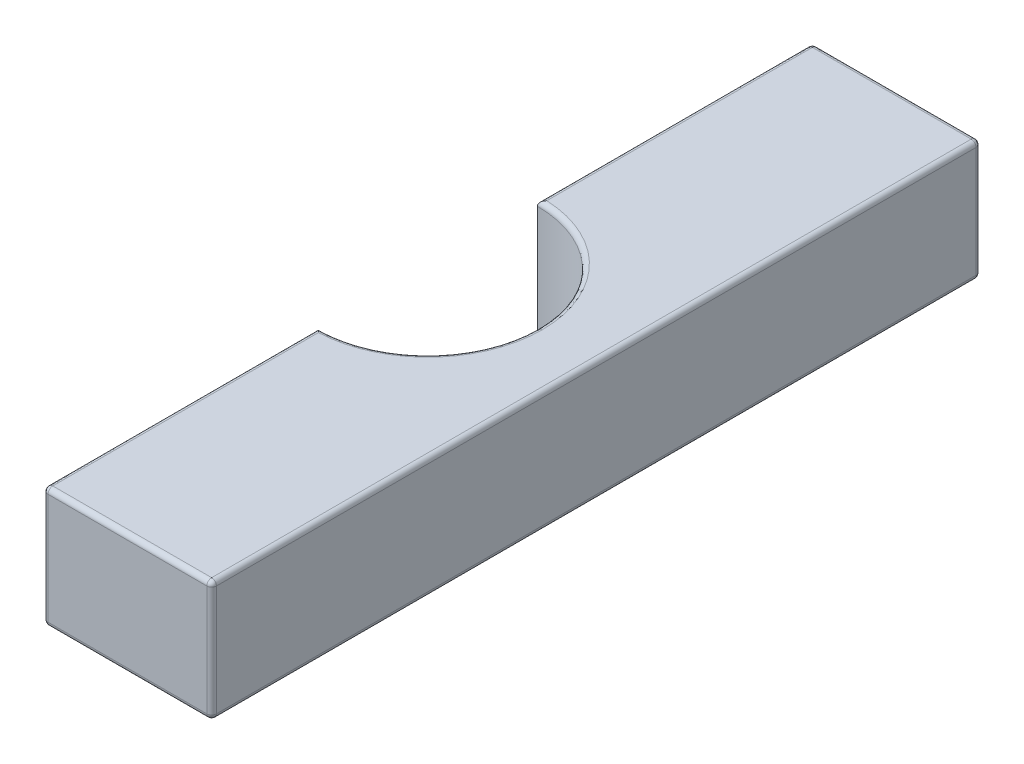
ISO-10303-21;
HEADER;
FILE_DESCRIPTION(('STEP AP214'),'2;1');
FILE_NAME('part.step','',(''),(''),'','','');
FILE_SCHEMA(('AUTOMOTIVE_DESIGN { 1 0 10303 214 1 1 1 1 }'));
ENDSEC;
DATA;
#1=APPLICATION_CONTEXT('core data for automotive mechanical design processes');
#2=APPLICATION_PROTOCOL_DEFINITION('international standard','automotive_design',2000,#1);
#3=PRODUCT_CONTEXT('',#1,'mechanical');
#4=PRODUCT('Part','Part','',(#3));
#5=PRODUCT_RELATED_PRODUCT_CATEGORY('part','',(#4));
#6=PRODUCT_DEFINITION_FORMATION('','',#4);
#7=PRODUCT_DEFINITION_CONTEXT('part definition',#1,'design');
#8=PRODUCT_DEFINITION('design','',#6,#7);
#9=PRODUCT_DEFINITION_SHAPE('','',#8);
#10=(LENGTH_UNIT() NAMED_UNIT(*) SI_UNIT(.MILLI.,.METRE.));
#11=(NAMED_UNIT(*) PLANE_ANGLE_UNIT() SI_UNIT($,.RADIAN.));
#12=(NAMED_UNIT(*) SI_UNIT($,.STERADIAN.) SOLID_ANGLE_UNIT());
#13=UNCERTAINTY_MEASURE_WITH_UNIT(LENGTH_MEASURE(1.E-05),#10,'distance_accuracy_value','');
#14=(GEOMETRIC_REPRESENTATION_CONTEXT(3) GLOBAL_UNCERTAINTY_ASSIGNED_CONTEXT((#13)) GLOBAL_UNIT_ASSIGNED_CONTEXT((#10,
#11,#12)) REPRESENTATION_CONTEXT('',''));
#15=CARTESIAN_POINT('',(0.,0.,0.));
#16=DIRECTION('',(0.,0.,1.));
#17=DIRECTION('',(1.,0.,0.));
#18=AXIS2_PLACEMENT_3D('',#15,#16,#17);
#19=CARTESIAN_POINT('',(-2.25,0.23,0.));
#20=DIRECTION('',(0.,-1.,0.));
#21=DIRECTION('',(1.,0.,0.));
#22=AXIS2_PLACEMENT_3D('',#19,#20,#21);
#23=TOROIDAL_SURFACE('',#22,0.475,0.02);
#24=CARTESIAN_POINT('',(-2.25,0.23,0.));
#25=DIRECTION('',(0.,1.,0.));
#26=DIRECTION('',(1.,0.,0.));
#27=AXIS2_PLACEMENT_3D('',#24,#25,#26);
#28=CIRCLE('',#27,0.455);
#29=CARTESIAN_POINT('',(-1.795,0.23,0.));
#30=VERTEX_POINT('',#29);
#31=CARTESIAN_POINT('',(-2.25,0.23,-0.455));
#32=VERTEX_POINT('',#31);
#33=EDGE_CURVE('E11',#30,#32,#28,.T.);
#34=ORIENTED_EDGE('',*,*,#33,.F.);
#35=CARTESIAN_POINT('',(-1.775,0.23,0.));
#36=DIRECTION('',(0.,0.,-1.));
#37=DIRECTION('',(-1.,0.,0.));
#38=AXIS2_PLACEMENT_3D('',#35,#36,#37);
#39=CIRCLE('',#38,0.0200000000000001);
#40=CARTESIAN_POINT('',(-1.775,0.25,0.));
#41=VERTEX_POINT('',#40);
#42=EDGE_CURVE('E24',#30,#41,#39,.T.);
#43=ORIENTED_EDGE('',*,*,#42,.T.);
#44=CARTESIAN_POINT('',(-2.25,0.25,0.));
#45=DIRECTION('',(0.,-1.,0.));
#46=DIRECTION('',(1.,0.,0.));
#47=AXIS2_PLACEMENT_3D('',#44,#45,#46);
#48=CIRCLE('',#47,0.475);
#49=CARTESIAN_POINT('',(-2.23,0.25,-0.474578760586691));
#50=VERTEX_POINT('',#49);
#51=EDGE_CURVE('E314',#50,#41,#48,.T.);
#52=ORIENTED_EDGE('',*,*,#51,.F.);
#53=CARTESIAN_POINT('',(-2.25,0.23,-0.455));
#54=CARTESIAN_POINT('',(-2.25,0.231778418403478,-0.455));
#55=CARTESIAN_POINT('',(-2.2497515921284,0.23358254075356,-0.455248562816982));
#56=CARTESIAN_POINT('',(-2.24930058699813,0.235242837168284,-0.455698876269529));
#57=CARTESIAN_POINT('',(-2.24885173877697,0.236895193299772,-0.456147036120872));
#58=CARTESIAN_POINT('',(-2.24819594569048,0.238451955219616,-0.456801153706736));
#59=CARTESIAN_POINT('',(-2.24741397458487,0.23983633514903,-0.457578717957634));
#60=CARTESIAN_POINT('',(-2.24630737480058,0.241795428675963,-0.458679081418805));
#61=CARTESIAN_POINT('',(-2.2449214134972,0.243469987509958,-0.460052929545787));
#62=CARTESIAN_POINT('',(-2.2434222737742,0.244827088951374,-0.461530855810917));
#63=CARTESIAN_POINT('',(-2.24135665352148,0.246696998859956,-0.463567246667915));
#64=CARTESIAN_POINT('',(-2.23901266247383,0.248034430433848,-0.465863626640187));
#65=CARTESIAN_POINT('',(-2.2366123111494,0.248875310372343,-0.468196322991089));
#66=CARTESIAN_POINT('',(-2.23467183566132,0.249555088741646,-0.470082105311372));
#67=CARTESIAN_POINT('',(-2.2326577939499,0.249924578116342,-0.47202768689978));
#68=CARTESIAN_POINT('',(-2.23064571796655,0.249989573680195,-0.473959278089606));
#69=CARTESIAN_POINT('',(-2.23043059007006,0.249996522900328,-0.474165800682686));
#70=CARTESIAN_POINT('',(-2.23021525393263,0.25,-0.474372252404168));
#71=CARTESIAN_POINT('',(-2.23,0.25,-0.474578760586691));
#72=B_SPLINE_CURVE_WITH_KNOTS('',3,(#53,#54,#55,#56,#57,#58,#59,#60,#61,#62,#63,#64,#65,#66,#67,
#68,#69,#70,#71),.UNSPECIFIED.,.F.,.F.,(4,3,3,3,3,3,4),(0.,5.33525521043193E-06,
1.06257549718434E-05,1.81421520425049E-05,2.85278294221037E-05,3.68751811878071E-05,
3.77700660768674E-05),.UNSPECIFIED.);
#73=EDGE_CURVE('E309',#32,#50,#72,.T.);
#74=ORIENTED_EDGE('',*,*,#73,.F.);
#75=EDGE_LOOP('',(#34,#43,#52,#74));
#76=FACE_BOUND('',#75,.T.);
#77=ADVANCED_FACE('F17',(#76),#23,.T.);
#78=CARTESIAN_POINT('',(-1.55,-0.25,1.598));
#79=DIRECTION('',(0.,1.,0.));
#80=DIRECTION('',(-1.,0.,0.));
#81=AXIS2_PLACEMENT_3D('',#78,#79,#80);
#82=PLANE('',#81);
#83=DIRECTION('',(-1.,0.,0.));
#84=VECTOR('',#83,1.);
#85=CARTESIAN_POINT('',(-1.55,-0.25,1.578));
#86=LINE('',#85,#84);
#87=CARTESIAN_POINT('',(-1.57,-0.25,1.578));
#88=VERTEX_POINT('',#87);
#89=CARTESIAN_POINT('',(-2.23,-0.25,1.578));
#90=VERTEX_POINT('',#89);
#91=EDGE_CURVE('E307',#88,#90,#86,.T.);
#92=ORIENTED_EDGE('',*,*,#91,.T.);
#93=DIRECTION('',(0.,0.,-1.));
#94=VECTOR('',#93,1.);
#95=CARTESIAN_POINT('',(-2.23,-0.25,1.598));
#96=LINE('',#95,#94);
#97=CARTESIAN_POINT('',(-2.23,-0.25,0.474578760586691));
#98=VERTEX_POINT('',#97);
#99=EDGE_CURVE('E305',#90,#98,#96,.T.);
#100=ORIENTED_EDGE('',*,*,#99,.T.);
#101=CARTESIAN_POINT('',(-2.25,-0.25,0.));
#102=DIRECTION('',(0.,1.,0.));
#103=DIRECTION('',(-1.,0.,0.));
#104=AXIS2_PLACEMENT_3D('',#101,#102,#103);
#105=CIRCLE('',#104,0.475);
#106=CARTESIAN_POINT('',(-2.23,-0.25,-0.474578760586691));
#107=VERTEX_POINT('',#106);
#108=EDGE_CURVE('E303',#98,#107,#105,.T.);
#109=ORIENTED_EDGE('',*,*,#108,.T.);
#110=DIRECTION('',(0.,0.,-1.));
#111=VECTOR('',#110,1.);
#112=CARTESIAN_POINT('',(-2.23,-0.25,1.598));
#113=LINE('',#112,#111);
#114=CARTESIAN_POINT('',(-2.23,-0.25,-1.578));
#115=VERTEX_POINT('',#114);
#116=EDGE_CURVE('E301',#107,#115,#113,.T.);
#117=ORIENTED_EDGE('',*,*,#116,.T.);
#118=DIRECTION('',(1.,0.,0.));
#119=VECTOR('',#118,1.);
#120=CARTESIAN_POINT('',(-1.55,-0.25,-1.578));
#121=LINE('',#120,#119);
#122=CARTESIAN_POINT('',(-1.57,-0.25,-1.578));
#123=VERTEX_POINT('',#122);
#124=EDGE_CURVE('E299',#115,#123,#121,.T.);
#125=ORIENTED_EDGE('',*,*,#124,.T.);
#126=DIRECTION('',(0.,0.,1.));
#127=VECTOR('',#126,1.);
#128=CARTESIAN_POINT('',(-1.57,-0.25,1.598));
#129=LINE('',#128,#127);
#130=EDGE_CURVE('E296',#123,#88,#129,.T.);
#131=ORIENTED_EDGE('',*,*,#130,.T.);
#132=EDGE_LOOP('',(#92,#100,#109,#117,#125,#131));
#133=FACE_BOUND('',#132,.T.);
#134=ADVANCED_FACE('F371',(#133),#82,.F.);
#135=CARTESIAN_POINT('',(-2.25,0.25,1.598));
#136=DIRECTION('',(0.,-1.,0.));
#137=DIRECTION('',(1.,0.,0.));
#138=AXIS2_PLACEMENT_3D('',#135,#136,#137);
#139=PLANE('',#138);
#140=DIRECTION('',(-1.,0.,0.));
#141=VECTOR('',#140,1.);
#142=CARTESIAN_POINT('',(-2.25,0.25,-1.578));
#143=LINE('',#142,#141);
#144=CARTESIAN_POINT('',(-1.57,0.25,-1.578));
#145=VERTEX_POINT('',#144);
#146=CARTESIAN_POINT('',(-2.23,0.25,-1.578));
#147=VERTEX_POINT('',#146);
#148=EDGE_CURVE('E294',#145,#147,#143,.T.);
#149=ORIENTED_EDGE('',*,*,#148,.T.);
#150=DIRECTION('',(0.,0.,1.));
#151=VECTOR('',#150,1.);
#152=CARTESIAN_POINT('',(-2.23,0.25,1.598));
#153=LINE('',#152,#151);
#154=EDGE_CURVE('E291',#147,#50,#153,.T.);
#155=ORIENTED_EDGE('',*,*,#154,.T.);
#156=ORIENTED_EDGE('',*,*,#51,.T.);
#157=CARTESIAN_POINT('',(-2.25,0.25,0.));
#158=DIRECTION('',(0.,-1.,0.));
#159=DIRECTION('',(1.,0.,0.));
#160=AXIS2_PLACEMENT_3D('',#157,#158,#159);
#161=CIRCLE('',#160,0.475);
#162=CARTESIAN_POINT('',(-2.23,0.25,0.474578760586691));
#163=VERTEX_POINT('',#162);
#164=EDGE_CURVE('E289',#41,#163,#161,.T.);
#165=ORIENTED_EDGE('',*,*,#164,.T.);
#166=DIRECTION('',(0.,0.,1.));
#167=VECTOR('',#166,1.);
#168=CARTESIAN_POINT('',(-2.23,0.25,1.598));
#169=LINE('',#168,#167);
#170=CARTESIAN_POINT('',(-2.23,0.25,1.578));
#171=VERTEX_POINT('',#170);
#172=EDGE_CURVE('E287',#163,#171,#169,.T.);
#173=ORIENTED_EDGE('',*,*,#172,.T.);
#174=DIRECTION('',(1.,0.,0.));
#175=VECTOR('',#174,1.);
#176=CARTESIAN_POINT('',(-2.25,0.25,1.578));
#177=LINE('',#176,#175);
#178=CARTESIAN_POINT('',(-1.57,0.25,1.578));
#179=VERTEX_POINT('',#178);
#180=EDGE_CURVE('E285',#171,#179,#177,.T.);
#181=ORIENTED_EDGE('',*,*,#180,.T.);
#182=DIRECTION('',(0.,0.,-1.));
#183=VECTOR('',#182,1.);
#184=CARTESIAN_POINT('',(-1.57,0.25,1.598));
#185=LINE('',#184,#183);
#186=EDGE_CURVE('E282',#179,#145,#185,.T.);
#187=ORIENTED_EDGE('',*,*,#186,.T.);
#188=EDGE_LOOP('',(#149,#155,#156,#165,#173,#181,#187));
#189=FACE_BOUND('',#188,.T.);
#190=ADVANCED_FACE('F323',(#189),#139,.F.);
#191=CARTESIAN_POINT('',(-2.25,-0.25,1.598));
#192=DIRECTION('',(1.,0.,0.));
#193=DIRECTION('',(0.,0.,-1.));
#194=AXIS2_PLACEMENT_3D('',#191,#192,#193);
#195=PLANE('',#194);
#196=DIRECTION('',(0.,1.,0.));
#197=VECTOR('',#196,1.);
#198=CARTESIAN_POINT('',(-2.25,1.,0.455));
#199=LINE('',#198,#197);
#200=CARTESIAN_POINT('',(-2.25,-0.23,0.455));
#201=VERTEX_POINT('',#200);
#202=CARTESIAN_POINT('',(-2.25,0.23,0.455));
#203=VERTEX_POINT('',#202);
#204=EDGE_CURVE('E280',#201,#203,#199,.T.);
#205=ORIENTED_EDGE('',*,*,#204,.F.);
#206=DIRECTION('',(0.,0.,1.));
#207=VECTOR('',#206,1.);
#208=CARTESIAN_POINT('',(-2.25,-0.23,1.598));
#209=LINE('',#208,#207);
#210=CARTESIAN_POINT('',(-2.25,-0.23,1.578));
#211=VERTEX_POINT('',#210);
#212=EDGE_CURVE('E278',#201,#211,#209,.T.);
#213=ORIENTED_EDGE('',*,*,#212,.T.);
#214=DIRECTION('',(0.,1.,0.));
#215=VECTOR('',#214,1.);
#216=CARTESIAN_POINT('',(-2.25,-0.25,1.578));
#217=LINE('',#216,#215);
#218=CARTESIAN_POINT('',(-2.25,0.23,1.578));
#219=VERTEX_POINT('',#218);
#220=EDGE_CURVE('E276',#211,#219,#217,.T.);
#221=ORIENTED_EDGE('',*,*,#220,.T.);
#222=DIRECTION('',(0.,0.,-1.));
#223=VECTOR('',#222,1.);
#224=CARTESIAN_POINT('',(-2.25,0.23,1.598));
#225=LINE('',#224,#223);
#226=EDGE_CURVE('E273',#219,#203,#225,.T.);
#227=ORIENTED_EDGE('',*,*,#226,.T.);
#228=EDGE_LOOP('',(#205,#213,#221,#227));
#229=FACE_BOUND('',#228,.T.);
#230=ADVANCED_FACE('F412',(#229),#195,.F.);
#231=CARTESIAN_POINT('',(-2.25,-0.25,1.598));
#232=DIRECTION('',(1.,0.,0.));
#233=DIRECTION('',(0.,0.,-1.));
#234=AXIS2_PLACEMENT_3D('',#231,#232,#233);
#235=PLANE('',#234);
#236=DIRECTION('',(0.,-1.,0.));
#237=VECTOR('',#236,1.);
#238=CARTESIAN_POINT('',(-2.25,-0.25,-1.578));
#239=LINE('',#238,#237);
#240=CARTESIAN_POINT('',(-2.25,0.23,-1.578));
#241=VERTEX_POINT('',#240);
#242=CARTESIAN_POINT('',(-2.25,-0.23,-1.578));
#243=VERTEX_POINT('',#242);
#244=EDGE_CURVE('E157',#241,#243,#239,.T.);
#245=ORIENTED_EDGE('',*,*,#244,.T.);
#246=DIRECTION('',(0.,0.,1.));
#247=VECTOR('',#246,1.);
#248=CARTESIAN_POINT('',(-2.25,-0.23,1.598));
#249=LINE('',#248,#247);
#250=CARTESIAN_POINT('',(-2.25,-0.23,-0.455));
#251=VERTEX_POINT('',#250);
#252=EDGE_CURVE('E270',#243,#251,#249,.T.);
#253=ORIENTED_EDGE('',*,*,#252,.T.);
#254=DIRECTION('',(0.,-1.,0.));
#255=VECTOR('',#254,1.);
#256=CARTESIAN_POINT('',(-2.25,1.,-0.455));
#257=LINE('',#256,#255);
#258=EDGE_CURVE('E268',#32,#251,#257,.T.);
#259=ORIENTED_EDGE('',*,*,#258,.F.);
#260=DIRECTION('',(0.,0.,-1.));
#261=VECTOR('',#260,1.);
#262=CARTESIAN_POINT('',(-2.25,0.23,1.598));
#263=LINE('',#262,#261);
#264=EDGE_CURVE('E266',#32,#241,#263,.T.);
#265=ORIENTED_EDGE('',*,*,#264,.T.);
#266=EDGE_LOOP('',(#245,#253,#259,#265));
#267=FACE_BOUND('',#266,.T.);
#268=ADVANCED_FACE('F355',(#267),#235,.F.);
#269=CARTESIAN_POINT('',(-1.55,0.25,1.598));
#270=DIRECTION('',(-1.,0.,0.));
#271=DIRECTION('',(0.,0.,1.));
#272=AXIS2_PLACEMENT_3D('',#269,#270,#271);
#273=PLANE('',#272);
#274=DIRECTION('',(0.,-1.,0.));
#275=VECTOR('',#274,1.);
#276=CARTESIAN_POINT('',(-1.55,0.25,1.578));
#277=LINE('',#276,#275);
#278=CARTESIAN_POINT('',(-1.55,0.23,1.578));
#279=VERTEX_POINT('',#278);
#280=CARTESIAN_POINT('',(-1.55,-0.23,1.578));
#281=VERTEX_POINT('',#280);
#282=EDGE_CURVE('E264',#279,#281,#277,.T.);
#283=ORIENTED_EDGE('',*,*,#282,.T.);
#284=DIRECTION('',(0.,0.,-1.));
#285=VECTOR('',#284,1.);
#286=CARTESIAN_POINT('',(-1.55,-0.23,1.598));
#287=LINE('',#286,#285);
#288=CARTESIAN_POINT('',(-1.55,-0.23,-1.578));
#289=VERTEX_POINT('',#288);
#290=EDGE_CURVE('E262',#281,#289,#287,.T.);
#291=ORIENTED_EDGE('',*,*,#290,.T.);
#292=DIRECTION('',(0.,1.,0.));
#293=VECTOR('',#292,1.);
#294=CARTESIAN_POINT('',(-1.55,0.25,-1.578));
#295=LINE('',#294,#293);
#296=CARTESIAN_POINT('',(-1.55,0.23,-1.578));
#297=VERTEX_POINT('',#296);
#298=EDGE_CURVE('E260',#289,#297,#295,.T.);
#299=ORIENTED_EDGE('',*,*,#298,.T.);
#300=DIRECTION('',(0.,0.,1.));
#301=VECTOR('',#300,1.);
#302=CARTESIAN_POINT('',(-1.55,0.23,1.598));
#303=LINE('',#302,#301);
#304=EDGE_CURVE('E257',#297,#279,#303,.T.);
#305=ORIENTED_EDGE('',*,*,#304,.T.);
#306=EDGE_LOOP('',(#283,#291,#299,#305));
#307=FACE_BOUND('',#306,.T.);
#308=ADVANCED_FACE('F420',(#307),#273,.F.);
#309=CARTESIAN_POINT('',(-2.25,-0.25,1.598));
#310=DIRECTION('',(0.,0.,-1.));
#311=DIRECTION('',(-1.,0.,0.));
#312=AXIS2_PLACEMENT_3D('',#309,#310,#311);
#313=PLANE('',#312);
#314=DIRECTION('',(0.,-1.,0.));
#315=VECTOR('',#314,1.);
#316=CARTESIAN_POINT('',(-2.23,-0.25,1.598));
#317=LINE('',#316,#315);
#318=CARTESIAN_POINT('',(-2.23,0.23,1.598));
#319=VERTEX_POINT('',#318);
#320=CARTESIAN_POINT('',(-2.23,-0.23,1.598));
#321=VERTEX_POINT('',#320);
#322=EDGE_CURVE('E255',#319,#321,#317,.T.);
#323=ORIENTED_EDGE('',*,*,#322,.T.);
#324=DIRECTION('',(1.,0.,0.));
#325=VECTOR('',#324,1.);
#326=CARTESIAN_POINT('',(-2.25,-0.23,1.598));
#327=LINE('',#326,#325);
#328=CARTESIAN_POINT('',(-1.57,-0.23,1.598));
#329=VERTEX_POINT('',#328);
#330=EDGE_CURVE('E253',#321,#329,#327,.T.);
#331=ORIENTED_EDGE('',*,*,#330,.T.);
#332=DIRECTION('',(0.,1.,0.));
#333=VECTOR('',#332,1.);
#334=CARTESIAN_POINT('',(-1.57,-0.25,1.598));
#335=LINE('',#334,#333);
#336=CARTESIAN_POINT('',(-1.57,0.23,1.598));
#337=VERTEX_POINT('',#336);
#338=EDGE_CURVE('E251',#329,#337,#335,.T.);
#339=ORIENTED_EDGE('',*,*,#338,.T.);
#340=DIRECTION('',(-1.,0.,0.));
#341=VECTOR('',#340,1.);
#342=CARTESIAN_POINT('',(-2.25,0.23,1.598));
#343=LINE('',#342,#341);
#344=EDGE_CURVE('E248',#337,#319,#343,.T.);
#345=ORIENTED_EDGE('',*,*,#344,.T.);
#346=EDGE_LOOP('',(#323,#331,#339,#345));
#347=FACE_BOUND('',#346,.T.);
#348=ADVANCED_FACE('F423',(#347),#313,.F.);
#349=CARTESIAN_POINT('',(-2.25,-0.25,-1.598));
#350=DIRECTION('',(0.,0.,-1.));
#351=DIRECTION('',(-1.,0.,0.));
#352=AXIS2_PLACEMENT_3D('',#349,#350,#351);
#353=PLANE('',#352);
#354=DIRECTION('',(0.,-1.,0.));
#355=VECTOR('',#354,1.);
#356=CARTESIAN_POINT('',(-1.57,-0.25,-1.598));
#357=LINE('',#356,#355);
#358=CARTESIAN_POINT('',(-1.57,0.23,-1.598));
#359=VERTEX_POINT('',#358);
#360=CARTESIAN_POINT('',(-1.57,-0.23,-1.598));
#361=VERTEX_POINT('',#360);
#362=EDGE_CURVE('E246',#359,#361,#357,.T.);
#363=ORIENTED_EDGE('',*,*,#362,.T.);
#364=DIRECTION('',(-1.,0.,0.));
#365=VECTOR('',#364,1.);
#366=CARTESIAN_POINT('',(-2.25,-0.23,-1.598));
#367=LINE('',#366,#365);
#368=CARTESIAN_POINT('',(-2.23,-0.23,-1.598));
#369=VERTEX_POINT('',#368);
#370=EDGE_CURVE('E138',#361,#369,#367,.T.);
#371=ORIENTED_EDGE('',*,*,#370,.T.);
#372=DIRECTION('',(0.,1.,0.));
#373=VECTOR('',#372,1.);
#374=CARTESIAN_POINT('',(-2.23,0.25,-1.598));
#375=LINE('',#374,#373);
#376=CARTESIAN_POINT('',(-2.23,0.23,-1.598));
#377=VERTEX_POINT('',#376);
#378=EDGE_CURVE('E132',#369,#377,#375,.T.);
#379=ORIENTED_EDGE('',*,*,#378,.T.);
#380=DIRECTION('',(1.,0.,0.));
#381=VECTOR('',#380,1.);
#382=CARTESIAN_POINT('',(-1.55,0.23,-1.598));
#383=LINE('',#382,#381);
#384=EDGE_CURVE('E135',#377,#359,#383,.T.);
#385=ORIENTED_EDGE('',*,*,#384,.T.);
#386=EDGE_LOOP('',(#363,#371,#379,#385));
#387=FACE_BOUND('',#386,.T.);
#388=ADVANCED_FACE('F134',(#387),#353,.T.);
#389=CARTESIAN_POINT('',(-2.25,1.,0.));
#390=DIRECTION('',(0.,-1.,0.));
#391=DIRECTION('',(0.,0.,-1.));
#392=AXIS2_PLACEMENT_3D('',#389,#390,#391);
#393=CYLINDRICAL_SURFACE('',#392,0.455);
#394=ORIENTED_EDGE('',*,*,#258,.T.);
#395=CARTESIAN_POINT('',(-2.25,-0.23,0.));
#396=DIRECTION('',(0.,-1.,0.));
#397=DIRECTION('',(-1.,0.,0.));
#398=AXIS2_PLACEMENT_3D('',#395,#396,#397);
#399=CIRCLE('',#398,0.455);
#400=EDGE_CURVE('E152',#251,#201,#399,.T.);
#401=ORIENTED_EDGE('',*,*,#400,.T.);
#402=ORIENTED_EDGE('',*,*,#204,.T.);
#403=CARTESIAN_POINT('',(-2.25,0.23,0.));
#404=DIRECTION('',(0.,1.,0.));
#405=DIRECTION('',(1.,0.,0.));
#406=AXIS2_PLACEMENT_3D('',#403,#404,#405);
#407=CIRCLE('',#406,0.455);
#408=EDGE_CURVE('E241',#203,#30,#407,.T.);
#409=ORIENTED_EDGE('',*,*,#408,.T.);
#410=ORIENTED_EDGE('',*,*,#33,.T.);
#411=EDGE_LOOP('',(#394,#401,#402,#409,#410));
#412=FACE_BOUND('',#411,.T.);
#413=ADVANCED_FACE('F358',(#412),#393,.F.);
#414=CARTESIAN_POINT('',(-2.23,-0.23,1.598));
#415=DIRECTION('',(0.,0.,-1.));
#416=DIRECTION('',(-1.,0.,0.));
#417=AXIS2_PLACEMENT_3D('',#414,#415,#416);
#418=CYLINDRICAL_SURFACE('',#417,0.0200000000000001);
#419=CARTESIAN_POINT('',(-2.23,-0.23,1.578));
#420=DIRECTION('',(0.,0.,1.));
#421=DIRECTION('',(1.,0.,0.));
#422=AXIS2_PLACEMENT_3D('',#419,#420,#421);
#423=CIRCLE('',#422,0.0200000000000001);
#424=EDGE_CURVE('E235',#211,#90,#423,.T.);
#425=ORIENTED_EDGE('',*,*,#424,.F.);
#426=ORIENTED_EDGE('',*,*,#212,.F.);
#427=CARTESIAN_POINT('',(-2.23,-0.25,0.474578760586691));
#428=CARTESIAN_POINT('',(-2.23021525393263,-0.25,0.474372252404169));
#429=CARTESIAN_POINT('',(-2.23043059007006,-0.249996522900328,0.47416580068269));
#430=CARTESIAN_POINT('',(-2.23064571796655,-0.249989573680195,0.47395927808961));
#431=CARTESIAN_POINT('',(-2.2326577939499,-0.249924578116342,0.472027686899773));
#432=CARTESIAN_POINT('',(-2.23467183566132,-0.249555088741646,0.470082105311373));
#433=CARTESIAN_POINT('',(-2.2366123111494,-0.248875310372343,0.46819632299109));
#434=CARTESIAN_POINT('',(-2.23901266247383,-0.248034430433847,0.465863626640187));
#435=CARTESIAN_POINT('',(-2.24135665352148,-0.246696998859955,0.463567246667915));
#436=CARTESIAN_POINT('',(-2.2434222737742,-0.244827088951374,0.461530855810917));
#437=CARTESIAN_POINT('',(-2.2449214134972,-0.243469987509957,0.460052929545787));
#438=CARTESIAN_POINT('',(-2.24630737480058,-0.241795428675963,0.458679081418805));
#439=CARTESIAN_POINT('',(-2.24741397458487,-0.23983633514903,0.457578717957634));
#440=CARTESIAN_POINT('',(-2.24819594569048,-0.238451955219616,0.456801153706737));
#441=CARTESIAN_POINT('',(-2.24885173877697,-0.236895193299772,0.456147036120872));
#442=CARTESIAN_POINT('',(-2.24930058699813,-0.235242837168284,0.455698876269529));
#443=CARTESIAN_POINT('',(-2.2497515921284,-0.23358254075356,0.455248562816982));
#444=CARTESIAN_POINT('',(-2.25,-0.231778418403477,0.455));
#445=CARTESIAN_POINT('',(-2.25,-0.23,0.455));
#446=B_SPLINE_CURVE_WITH_KNOTS('',3,(#427,#428,#429,#430,#431,#432,#433,#434,#435,#436,#437,
#438,#439,#440,#441,#442,#443,#444,#445),.UNSPECIFIED.,.F.,.F.,(4,3,3,3,3,3,4),
(-8.9488488906002E-07,0.,8.36979500324859E-06,1.87833959963531E-05,2.63200021452561E-05,
3.16247262913835E-05,3.69743262189681E-05),.UNSPECIFIED.);
#447=EDGE_CURVE('E230',#98,#201,#446,.T.);
#448=ORIENTED_EDGE('',*,*,#447,.F.);
#449=ORIENTED_EDGE('',*,*,#99,.F.);
#450=EDGE_LOOP('',(#425,#426,#448,#449));
#451=FACE_BOUND('',#450,.T.);
#452=ADVANCED_FACE('F432',(#451),#418,.T.);
#453=CARTESIAN_POINT('',(-2.23,-0.25,1.578));
#454=DIRECTION('',(0.,-1.,0.));
#455=DIRECTION('',(0.,0.,-1.));
#456=AXIS2_PLACEMENT_3D('',#453,#454,#455);
#457=CYLINDRICAL_SURFACE('',#456,0.0200000000000001);
#458=CARTESIAN_POINT('',(-2.23,0.23,1.578));
#459=DIRECTION('',(0.,1.,0.));
#460=DIRECTION('',(0.,0.,1.));
#461=AXIS2_PLACEMENT_3D('',#458,#459,#460);
#462=CIRCLE('',#461,0.0200000000000001);
#463=EDGE_CURVE('E227',#219,#319,#462,.T.);
#464=ORIENTED_EDGE('',*,*,#463,.F.);
#465=ORIENTED_EDGE('',*,*,#220,.F.);
#466=CARTESIAN_POINT('',(-2.23,-0.23,1.578));
#467=DIRECTION('',(0.,-1.,0.));
#468=DIRECTION('',(0.,0.,-1.));
#469=AXIS2_PLACEMENT_3D('',#466,#467,#468);
#470=CIRCLE('',#469,0.0200000000000001);
#471=EDGE_CURVE('E221',#321,#211,#470,.T.);
#472=ORIENTED_EDGE('',*,*,#471,.F.);
#473=ORIENTED_EDGE('',*,*,#322,.F.);
#474=EDGE_LOOP('',(#464,#465,#472,#473));
#475=FACE_BOUND('',#474,.T.);
#476=ADVANCED_FACE('F435',(#475),#457,.T.);
#477=CARTESIAN_POINT('',(-2.23,0.23,1.598));
#478=DIRECTION('',(0.,0.,-1.));
#479=DIRECTION('',(-1.,0.,0.));
#480=AXIS2_PLACEMENT_3D('',#477,#478,#479);
#481=CYLINDRICAL_SURFACE('',#480,0.0200000000000001);
#482=CARTESIAN_POINT('',(-2.25,0.23,0.455));
#483=CARTESIAN_POINT('',(-2.25,0.231778418403478,0.455));
#484=CARTESIAN_POINT('',(-2.2497515921284,0.23358254075356,0.455248562816982));
#485=CARTESIAN_POINT('',(-2.24930058699813,0.235242837168284,0.455698876269529));
#486=CARTESIAN_POINT('',(-2.24885173877697,0.236895193299772,0.456147036120872));
#487=CARTESIAN_POINT('',(-2.24819594569048,0.238451955219616,0.456801153706736));
#488=CARTESIAN_POINT('',(-2.24741397458487,0.23983633514903,0.457578717957634));
#489=CARTESIAN_POINT('',(-2.24630737480058,0.241795428675963,0.458679081418805));
#490=CARTESIAN_POINT('',(-2.2449214134972,0.243469987509958,0.460052929545787));
#491=CARTESIAN_POINT('',(-2.2434222737742,0.244827088951374,0.461530855810917));
#492=CARTESIAN_POINT('',(-2.24135665352148,0.246696998859956,0.463567246667915));
#493=CARTESIAN_POINT('',(-2.23901266247383,0.248034430433848,0.465863626640187));
#494=CARTESIAN_POINT('',(-2.2366123111494,0.248875310372343,0.468196322991089));
#495=CARTESIAN_POINT('',(-2.23467183566132,0.249555088741646,0.470082105311372));
#496=CARTESIAN_POINT('',(-2.2326577939499,0.249924578116342,0.47202768689978));
#497=CARTESIAN_POINT('',(-2.23064571796655,0.249989573680195,0.473959278089606));
#498=CARTESIAN_POINT('',(-2.23043059007006,0.249996522900328,0.474165800682686));
#499=CARTESIAN_POINT('',(-2.23021525393263,0.25,0.474372252404168));
#500=CARTESIAN_POINT('',(-2.23,0.25,0.474578760586691));
#501=B_SPLINE_CURVE_WITH_KNOTS('',3,(#482,#483,#484,#485,#486,#487,#488,#489,#490,#491,#492,
#493,#494,#495,#496,#497,#498,#499,#500),.UNSPECIFIED.,.F.,.F.,(4,3,3,3,3,3,4),(0.,
5.33525521043193E-06,1.06257549718434E-05,1.81421520425049E-05,2.85278294221037E-05,
3.68751811878071E-05,3.77700660768674E-05),.UNSPECIFIED.);
#502=EDGE_CURVE('E216',#203,#163,#501,.T.);
#503=ORIENTED_EDGE('',*,*,#502,.F.);
#504=ORIENTED_EDGE('',*,*,#226,.F.);
#505=CARTESIAN_POINT('',(-2.23,0.23,1.578));
#506=DIRECTION('',(0.,0.,1.));
#507=DIRECTION('',(1.,0.,0.));
#508=AXIS2_PLACEMENT_3D('',#505,#506,#507);
#509=CIRCLE('',#508,0.0200000000000001);
#510=EDGE_CURVE('E210',#171,#219,#509,.T.);
#511=ORIENTED_EDGE('',*,*,#510,.F.);
#512=ORIENTED_EDGE('',*,*,#172,.F.);
#513=EDGE_LOOP('',(#503,#504,#511,#512));
#514=FACE_BOUND('',#513,.T.);
#515=ADVANCED_FACE('F330',(#514),#481,.T.);
#516=CARTESIAN_POINT('',(-2.25,-0.23,0.));
#517=DIRECTION('',(0.,1.,0.));
#518=DIRECTION('',(-1.,0.,0.));
#519=AXIS2_PLACEMENT_3D('',#516,#517,#518);
#520=TOROIDAL_SURFACE('',#519,0.475,0.02);
#521=ORIENTED_EDGE('',*,*,#447,.T.);
#522=ORIENTED_EDGE('',*,*,#400,.F.);
#523=CARTESIAN_POINT('',(-2.23,-0.25,-0.474578760586691));
#524=CARTESIAN_POINT('',(-2.23021525393263,-0.25,-0.474372252404169));
#525=CARTESIAN_POINT('',(-2.23043059007006,-0.249996522900328,-0.47416580068269));
#526=CARTESIAN_POINT('',(-2.23064571796655,-0.249989573680195,-0.47395927808961));
#527=CARTESIAN_POINT('',(-2.2326577939499,-0.249924578116342,-0.472027686899773));
#528=CARTESIAN_POINT('',(-2.23467183566132,-0.249555088741646,-0.470082105311373));
#529=CARTESIAN_POINT('',(-2.2366123111494,-0.248875310372343,-0.46819632299109));
#530=CARTESIAN_POINT('',(-2.23901266247383,-0.248034430433847,-0.465863626640187));
#531=CARTESIAN_POINT('',(-2.24135665352148,-0.246696998859955,-0.463567246667915));
#532=CARTESIAN_POINT('',(-2.2434222737742,-0.244827088951374,-0.461530855810917));
#533=CARTESIAN_POINT('',(-2.2449214134972,-0.243469987509957,-0.460052929545787));
#534=CARTESIAN_POINT('',(-2.24630737480058,-0.241795428675963,-0.458679081418805));
#535=CARTESIAN_POINT('',(-2.24741397458487,-0.23983633514903,-0.457578717957634));
#536=CARTESIAN_POINT('',(-2.24819594569048,-0.238451955219616,-0.456801153706737));
#537=CARTESIAN_POINT('',(-2.24885173877697,-0.236895193299772,-0.456147036120872));
#538=CARTESIAN_POINT('',(-2.24930058699813,-0.235242837168284,-0.455698876269529));
#539=CARTESIAN_POINT('',(-2.2497515921284,-0.23358254075356,-0.455248562816982));
#540=CARTESIAN_POINT('',(-2.25,-0.231778418403477,-0.455));
#541=CARTESIAN_POINT('',(-2.25,-0.23,-0.455));
#542=B_SPLINE_CURVE_WITH_KNOTS('',3,(#523,#524,#525,#526,#527,#528,#529,#530,#531,#532,#533,
#534,#535,#536,#537,#538,#539,#540,#541),.UNSPECIFIED.,.F.,.F.,(4,3,3,3,3,3,4),
(-8.9488488906002E-07,0.,8.36979500324859E-06,1.87833959963531E-05,2.63200021452561E-05,
3.16247262913835E-05,3.69743262189681E-05),.UNSPECIFIED.);
#543=EDGE_CURVE('E205',#107,#251,#542,.T.);
#544=ORIENTED_EDGE('',*,*,#543,.F.);
#545=ORIENTED_EDGE('',*,*,#108,.F.);
#546=EDGE_LOOP('',(#521,#522,#544,#545));
#547=FACE_BOUND('',#546,.T.);
#548=ADVANCED_FACE('F361',(#547),#520,.T.);
#549=CARTESIAN_POINT('',(-2.23,-0.23,1.578));
#550=DIRECTION('',(0.,1.,0.));
#551=DIRECTION('',(1.,0.,0.));
#552=AXIS2_PLACEMENT_3D('',#549,#550,#551);
#553=SPHERICAL_SURFACE('',#552,0.02);
#554=ORIENTED_EDGE('',*,*,#471,.T.);
#555=ORIENTED_EDGE('',*,*,#424,.T.);
#556=CARTESIAN_POINT('',(-2.23,-0.23,1.578));
#557=DIRECTION('',(1.,0.,0.));
#558=DIRECTION('',(0.,0.,1.));
#559=AXIS2_PLACEMENT_3D('',#556,#557,#558);
#560=CIRCLE('',#559,0.0200000000000001);
#561=EDGE_CURVE('E202',#321,#90,#560,.T.);
#562=ORIENTED_EDGE('',*,*,#561,.F.);
#563=EDGE_LOOP('',(#554,#555,#562));
#564=FACE_BOUND('',#563,.T.);
#565=ADVANCED_FACE('F444',(#564),#553,.T.);
#566=CARTESIAN_POINT('',(-2.23,0.23,1.578));
#567=DIRECTION('',(0.,1.,0.));
#568=DIRECTION('',(1.,0.,0.));
#569=AXIS2_PLACEMENT_3D('',#566,#567,#568);
#570=SPHERICAL_SURFACE('',#569,0.02);
#571=ORIENTED_EDGE('',*,*,#510,.T.);
#572=ORIENTED_EDGE('',*,*,#463,.T.);
#573=CARTESIAN_POINT('',(-2.23,0.23,1.578));
#574=DIRECTION('',(1.,0.,0.));
#575=DIRECTION('',(0.,0.,1.));
#576=AXIS2_PLACEMENT_3D('',#573,#574,#575);
#577=CIRCLE('',#576,0.0200000000000001);
#578=EDGE_CURVE('E199',#171,#319,#577,.T.);
#579=ORIENTED_EDGE('',*,*,#578,.F.);
#580=EDGE_LOOP('',(#571,#572,#579));
#581=FACE_BOUND('',#580,.T.);
#582=ADVANCED_FACE('F447',(#581),#570,.T.);
#583=CARTESIAN_POINT('',(-2.25,0.23,0.));
#584=DIRECTION('',(0.,-1.,0.));
#585=DIRECTION('',(1.,0.,0.));
#586=AXIS2_PLACEMENT_3D('',#583,#584,#585);
#587=TOROIDAL_SURFACE('',#586,0.475,0.02);
#588=ORIENTED_EDGE('',*,*,#42,.F.);
#589=ORIENTED_EDGE('',*,*,#408,.F.);
#590=ORIENTED_EDGE('',*,*,#502,.T.);
#591=ORIENTED_EDGE('',*,*,#164,.F.);
#592=EDGE_LOOP('',(#588,#589,#590,#591));
#593=FACE_BOUND('',#592,.T.);
#594=ADVANCED_FACE('F326',(#593),#587,.T.);
#595=CARTESIAN_POINT('',(-2.23,-0.23,1.598));
#596=DIRECTION('',(0.,0.,-1.));
#597=DIRECTION('',(-1.,0.,0.));
#598=AXIS2_PLACEMENT_3D('',#595,#596,#597);
#599=CYLINDRICAL_SURFACE('',#598,0.0200000000000001);
#600=ORIENTED_EDGE('',*,*,#543,.T.);
#601=ORIENTED_EDGE('',*,*,#252,.F.);
#602=CARTESIAN_POINT('',(-2.23,-0.23,-1.578));
#603=DIRECTION('',(0.,0.,-1.));
#604=DIRECTION('',(-1.,0.,0.));
#605=AXIS2_PLACEMENT_3D('',#602,#603,#604);
#606=CIRCLE('',#605,0.0200000000000001);
#607=EDGE_CURVE('E196',#115,#243,#606,.T.);
#608=ORIENTED_EDGE('',*,*,#607,.F.);
#609=ORIENTED_EDGE('',*,*,#116,.F.);
#610=EDGE_LOOP('',(#600,#601,#608,#609));
#611=FACE_BOUND('',#610,.T.);
#612=ADVANCED_FACE('F366',(#611),#599,.T.);
#613=CARTESIAN_POINT('',(-2.25,-0.23,1.578));
#614=DIRECTION('',(1.,0.,0.));
#615=DIRECTION('',(0.,1.,0.));
#616=AXIS2_PLACEMENT_3D('',#613,#614,#615);
#617=CYLINDRICAL_SURFACE('',#616,0.02);
#618=ORIENTED_EDGE('',*,*,#561,.T.);
#619=ORIENTED_EDGE('',*,*,#91,.F.);
#620=CARTESIAN_POINT('',(-1.57,-0.23,1.578));
#621=DIRECTION('',(1.,0.,0.));
#622=DIRECTION('',(0.,0.,-1.));
#623=AXIS2_PLACEMENT_3D('',#620,#621,#622);
#624=CIRCLE('',#623,0.0200000000000001);
#625=EDGE_CURVE('E193',#329,#88,#624,.T.);
#626=ORIENTED_EDGE('',*,*,#625,.F.);
#627=ORIENTED_EDGE('',*,*,#330,.F.);
#628=EDGE_LOOP('',(#618,#619,#626,#627));
#629=FACE_BOUND('',#628,.T.);
#630=ADVANCED_FACE('F456',(#629),#617,.T.);
#631=CARTESIAN_POINT('',(-1.57,-0.25,1.578));
#632=DIRECTION('',(0.,1.,0.));
#633=DIRECTION('',(0.,0.,1.));
#634=AXIS2_PLACEMENT_3D('',#631,#632,#633);
#635=CYLINDRICAL_SURFACE('',#634,0.0200000000000001);
#636=CARTESIAN_POINT('',(-1.57,0.23,1.578));
#637=DIRECTION('',(0.,1.,0.));
#638=DIRECTION('',(0.,0.,1.));
#639=AXIS2_PLACEMENT_3D('',#636,#637,#638);
#640=CIRCLE('',#639,0.0200000000000001);
#641=EDGE_CURVE('E190',#337,#279,#640,.T.);
#642=ORIENTED_EDGE('',*,*,#641,.F.);
#643=ORIENTED_EDGE('',*,*,#338,.F.);
#644=CARTESIAN_POINT('',(-1.57,-0.23,1.578));
#645=DIRECTION('',(0.,-1.,0.));
#646=DIRECTION('',(0.,0.,-1.));
#647=AXIS2_PLACEMENT_3D('',#644,#645,#646);
#648=CIRCLE('',#647,0.0200000000000001);
#649=EDGE_CURVE('E187',#281,#329,#648,.T.);
#650=ORIENTED_EDGE('',*,*,#649,.F.);
#651=ORIENTED_EDGE('',*,*,#282,.F.);
#652=EDGE_LOOP('',(#642,#643,#650,#651));
#653=FACE_BOUND('',#652,.T.);
#654=ADVANCED_FACE('F459',(#653),#635,.T.);
#655=CARTESIAN_POINT('',(-2.25,0.23,1.578));
#656=DIRECTION('',(-1.,0.,0.));
#657=DIRECTION('',(0.,-1.,0.));
#658=AXIS2_PLACEMENT_3D('',#655,#656,#657);
#659=CYLINDRICAL_SURFACE('',#658,0.02);
#660=ORIENTED_EDGE('',*,*,#578,.T.);
#661=ORIENTED_EDGE('',*,*,#344,.F.);
#662=CARTESIAN_POINT('',(-1.57,0.23,1.578));
#663=DIRECTION('',(1.,0.,0.));
#664=DIRECTION('',(0.,0.,-1.));
#665=AXIS2_PLACEMENT_3D('',#662,#663,#664);
#666=CIRCLE('',#665,0.0200000000000001);
#667=EDGE_CURVE('E184',#179,#337,#666,.T.);
#668=ORIENTED_EDGE('',*,*,#667,.F.);
#669=ORIENTED_EDGE('',*,*,#180,.F.);
#670=EDGE_LOOP('',(#660,#661,#668,#669));
#671=FACE_BOUND('',#670,.T.);
#672=ADVANCED_FACE('F338',(#671),#659,.T.);
#673=CARTESIAN_POINT('',(-2.23,0.23,1.598));
#674=DIRECTION('',(0.,0.,-1.));
#675=DIRECTION('',(-1.,0.,0.));
#676=AXIS2_PLACEMENT_3D('',#673,#674,#675);
#677=CYLINDRICAL_SURFACE('',#676,0.0200000000000001);
#678=ORIENTED_EDGE('',*,*,#73,.T.);
#679=ORIENTED_EDGE('',*,*,#154,.F.);
#680=CARTESIAN_POINT('',(-2.23,0.23,-1.578));
#681=DIRECTION('',(0.,0.,-1.));
#682=DIRECTION('',(-1.,0.,0.));
#683=AXIS2_PLACEMENT_3D('',#680,#681,#682);
#684=CIRCLE('',#683,0.0200000000000001);
#685=EDGE_CURVE('E166',#241,#147,#684,.T.);
#686=ORIENTED_EDGE('',*,*,#685,.F.);
#687=ORIENTED_EDGE('',*,*,#264,.F.);
#688=EDGE_LOOP('',(#678,#679,#686,#687));
#689=FACE_BOUND('',#688,.T.);
#690=ADVANCED_FACE('F351',(#689),#677,.T.);
#691=CARTESIAN_POINT('',(-2.23,-0.25,-1.578));
#692=DIRECTION('',(0.,1.,0.));
#693=DIRECTION('',(0.,0.,1.));
#694=AXIS2_PLACEMENT_3D('',#691,#692,#693);
#695=CYLINDRICAL_SURFACE('',#694,0.0200000000000001);
#696=CARTESIAN_POINT('',(-2.23,-0.23,-1.578));
#697=DIRECTION('',(0.,-1.,0.));
#698=DIRECTION('',(0.,0.,-1.));
#699=AXIS2_PLACEMENT_3D('',#696,#697,#698);
#700=CIRCLE('',#699,0.0200000000000001);
#701=EDGE_CURVE('E161',#243,#369,#700,.T.);
#702=ORIENTED_EDGE('',*,*,#701,.F.);
#703=ORIENTED_EDGE('',*,*,#244,.F.);
#704=CARTESIAN_POINT('',(-2.23,0.23,-1.578));
#705=DIRECTION('',(0.,1.,0.));
#706=DIRECTION('',(0.,0.,1.));
#707=AXIS2_PLACEMENT_3D('',#704,#705,#706);
#708=CIRCLE('',#707,0.0200000000000001);
#709=EDGE_CURVE('E155',#377,#241,#708,.T.);
#710=ORIENTED_EDGE('',*,*,#709,.F.);
#711=ORIENTED_EDGE('',*,*,#378,.F.);
#712=EDGE_LOOP('',(#702,#703,#710,#711));
#713=FACE_BOUND('',#712,.T.);
#714=ADVANCED_FACE('F156',(#713),#695,.T.);
#715=CARTESIAN_POINT('',(-2.23,-0.23,-1.578));
#716=DIRECTION('',(0.,1.,0.));
#717=DIRECTION('',(1.,0.,0.));
#718=AXIS2_PLACEMENT_3D('',#715,#716,#717);
#719=SPHERICAL_SURFACE('',#718,0.02);
#720=ORIENTED_EDGE('',*,*,#607,.T.);
#721=ORIENTED_EDGE('',*,*,#701,.T.);
#722=CARTESIAN_POINT('',(-2.23,-0.23,-1.578));
#723=DIRECTION('',(1.,0.,0.));
#724=DIRECTION('',(0.,0.,1.));
#725=AXIS2_PLACEMENT_3D('',#722,#723,#724);
#726=CIRCLE('',#725,0.0200000000000001);
#727=EDGE_CURVE('E162',#115,#369,#726,.T.);
#728=ORIENTED_EDGE('',*,*,#727,.F.);
#729=EDGE_LOOP('',(#720,#721,#728));
#730=FACE_BOUND('',#729,.T.);
#731=ADVANCED_FACE('F470',(#730),#719,.T.);
#732=CARTESIAN_POINT('',(-1.57,-0.23,1.578));
#733=DIRECTION('',(0.,1.,0.));
#734=DIRECTION('',(1.,0.,0.));
#735=AXIS2_PLACEMENT_3D('',#732,#733,#734);
#736=SPHERICAL_SURFACE('',#735,0.02);
#737=ORIENTED_EDGE('',*,*,#649,.T.);
#738=ORIENTED_EDGE('',*,*,#625,.T.);
#739=CARTESIAN_POINT('',(-1.57,-0.23,1.578));
#740=DIRECTION('',(0.,0.,-1.));
#741=DIRECTION('',(1.,0.,0.));
#742=AXIS2_PLACEMENT_3D('',#739,#740,#741);
#743=CIRCLE('',#742,0.0200000000000001);
#744=EDGE_CURVE('E171',#281,#88,#743,.T.);
#745=ORIENTED_EDGE('',*,*,#744,.F.);
#746=EDGE_LOOP('',(#737,#738,#745));
#747=FACE_BOUND('',#746,.T.);
#748=ADVANCED_FACE('F473',(#747),#736,.T.);
#749=CARTESIAN_POINT('',(-1.57,0.23,1.578));
#750=DIRECTION('',(0.,1.,0.));
#751=DIRECTION('',(1.,0.,0.));
#752=AXIS2_PLACEMENT_3D('',#749,#750,#751);
#753=SPHERICAL_SURFACE('',#752,0.02);
#754=ORIENTED_EDGE('',*,*,#667,.T.);
#755=ORIENTED_EDGE('',*,*,#641,.T.);
#756=CARTESIAN_POINT('',(-1.57,0.23,1.578));
#757=DIRECTION('',(0.,0.,-1.));
#758=DIRECTION('',(1.,0.,0.));
#759=AXIS2_PLACEMENT_3D('',#756,#757,#758);
#760=CIRCLE('',#759,0.0200000000000001);
#761=EDGE_CURVE('E167',#179,#279,#760,.T.);
#762=ORIENTED_EDGE('',*,*,#761,.F.);
#763=EDGE_LOOP('',(#754,#755,#762));
#764=FACE_BOUND('',#763,.T.);
#765=ADVANCED_FACE('F343',(#764),#753,.T.);
#766=CARTESIAN_POINT('',(-2.23,0.23,-1.578));
#767=DIRECTION('',(0.,1.,0.));
#768=DIRECTION('',(1.,0.,0.));
#769=AXIS2_PLACEMENT_3D('',#766,#767,#768);
#770=SPHERICAL_SURFACE('',#769,0.02);
#771=ORIENTED_EDGE('',*,*,#709,.T.);
#772=ORIENTED_EDGE('',*,*,#685,.T.);
#773=CARTESIAN_POINT('',(-2.23,0.23,-1.578));
#774=DIRECTION('',(1.,0.,0.));
#775=DIRECTION('',(0.,0.,1.));
#776=AXIS2_PLACEMENT_3D('',#773,#774,#775);
#777=CIRCLE('',#776,0.0200000000000001);
#778=EDGE_CURVE('E148',#377,#147,#777,.T.);
#779=ORIENTED_EDGE('',*,*,#778,.F.);
#780=EDGE_LOOP('',(#771,#772,#779));
#781=FACE_BOUND('',#780,.T.);
#782=ADVANCED_FACE('F164',(#781),#770,.T.);
#783=CARTESIAN_POINT('',(-1.55,-0.23,-1.578));
#784=DIRECTION('',(-1.,0.,0.));
#785=DIRECTION('',(0.,-1.,0.));
#786=AXIS2_PLACEMENT_3D('',#783,#784,#785);
#787=CYLINDRICAL_SURFACE('',#786,0.02);
#788=ORIENTED_EDGE('',*,*,#727,.T.);
#789=ORIENTED_EDGE('',*,*,#370,.F.);
#790=CARTESIAN_POINT('',(-1.57,-0.23,-1.578));
#791=DIRECTION('',(1.,0.,0.));
#792=DIRECTION('',(0.,0.,-1.));
#793=AXIS2_PLACEMENT_3D('',#790,#791,#792);
#794=CIRCLE('',#793,0.0200000000000001);
#795=EDGE_CURVE('E168',#123,#361,#794,.T.);
#796=ORIENTED_EDGE('',*,*,#795,.F.);
#797=ORIENTED_EDGE('',*,*,#124,.F.);
#798=EDGE_LOOP('',(#788,#789,#796,#797));
#799=FACE_BOUND('',#798,.T.);
#800=ADVANCED_FACE('F375',(#799),#787,.T.);
#801=CARTESIAN_POINT('',(-1.57,-0.23,1.598));
#802=DIRECTION('',(0.,0.,-1.));
#803=DIRECTION('',(-1.,0.,0.));
#804=AXIS2_PLACEMENT_3D('',#801,#802,#803);
#805=CYLINDRICAL_SURFACE('',#804,0.0200000000000001);
#806=ORIENTED_EDGE('',*,*,#744,.T.);
#807=ORIENTED_EDGE('',*,*,#130,.F.);
#808=CARTESIAN_POINT('',(-1.57,-0.23,-1.578));
#809=DIRECTION('',(0.,0.,-1.));
#810=DIRECTION('',(-1.,0.,0.));
#811=AXIS2_PLACEMENT_3D('',#808,#809,#810);
#812=CIRCLE('',#811,0.0200000000000001);
#813=EDGE_CURVE('E174',#289,#123,#812,.T.);
#814=ORIENTED_EDGE('',*,*,#813,.F.);
#815=ORIENTED_EDGE('',*,*,#290,.F.);
#816=EDGE_LOOP('',(#806,#807,#814,#815));
#817=FACE_BOUND('',#816,.T.);
#818=ADVANCED_FACE('F484',(#817),#805,.T.);
#819=CARTESIAN_POINT('',(-1.57,0.23,1.598));
#820=DIRECTION('',(0.,0.,-1.));
#821=DIRECTION('',(-1.,0.,0.));
#822=AXIS2_PLACEMENT_3D('',#819,#820,#821);
#823=CYLINDRICAL_SURFACE('',#822,0.0200000000000001);
#824=ORIENTED_EDGE('',*,*,#761,.T.);
#825=ORIENTED_EDGE('',*,*,#304,.F.);
#826=CARTESIAN_POINT('',(-1.57,0.23,-1.578));
#827=DIRECTION('',(0.,0.,-1.));
#828=DIRECTION('',(-1.,0.,0.));
#829=AXIS2_PLACEMENT_3D('',#826,#827,#828);
#830=CIRCLE('',#829,0.0200000000000001);
#831=EDGE_CURVE('E349',#145,#297,#830,.T.);
#832=ORIENTED_EDGE('',*,*,#831,.F.);
#833=ORIENTED_EDGE('',*,*,#186,.F.);
#834=EDGE_LOOP('',(#824,#825,#832,#833));
#835=FACE_BOUND('',#834,.T.);
#836=ADVANCED_FACE('F346',(#835),#823,.T.);
#837=CARTESIAN_POINT('',(-2.25,0.23,-1.578));
#838=DIRECTION('',(1.,0.,0.));
#839=DIRECTION('',(0.,1.,0.));
#840=AXIS2_PLACEMENT_3D('',#837,#838,#839);
#841=CYLINDRICAL_SURFACE('',#840,0.02);
#842=ORIENTED_EDGE('',*,*,#778,.T.);
#843=ORIENTED_EDGE('',*,*,#148,.F.);
#844=CARTESIAN_POINT('',(-1.57,0.23,-1.578));
#845=DIRECTION('',(1.,0.,0.));
#846=DIRECTION('',(0.,0.,-1.));
#847=AXIS2_PLACEMENT_3D('',#844,#845,#846);
#848=CIRCLE('',#847,0.0200000000000001);
#849=EDGE_CURVE('E150',#359,#145,#848,.T.);
#850=ORIENTED_EDGE('',*,*,#849,.F.);
#851=ORIENTED_EDGE('',*,*,#384,.F.);
#852=EDGE_LOOP('',(#842,#843,#850,#851));
#853=FACE_BOUND('',#852,.T.);
#854=ADVANCED_FACE('F146',(#853),#841,.T.);
#855=CARTESIAN_POINT('',(-1.57,-0.23,-1.578));
#856=DIRECTION('',(0.,1.,0.));
#857=DIRECTION('',(1.,0.,0.));
#858=AXIS2_PLACEMENT_3D('',#855,#856,#857);
#859=SPHERICAL_SURFACE('',#858,0.02);
#860=ORIENTED_EDGE('',*,*,#813,.T.);
#861=ORIENTED_EDGE('',*,*,#795,.T.);
#862=CARTESIAN_POINT('',(-1.57,-0.23,-1.578));
#863=DIRECTION('',(0.,1.,0.));
#864=DIRECTION('',(0.,0.,-1.));
#865=AXIS2_PLACEMENT_3D('',#862,#863,#864);
#866=CIRCLE('',#865,0.0200000000000001);
#867=EDGE_CURVE('E382',#289,#361,#866,.T.);
#868=ORIENTED_EDGE('',*,*,#867,.F.);
#869=EDGE_LOOP('',(#860,#861,#868));
#870=FACE_BOUND('',#869,.T.);
#871=ADVANCED_FACE('F381',(#870),#859,.T.);
#872=CARTESIAN_POINT('',(-1.57,0.23,-1.578));
#873=DIRECTION('',(0.,1.,0.));
#874=DIRECTION('',(1.,0.,0.));
#875=AXIS2_PLACEMENT_3D('',#872,#873,#874);
#876=SPHERICAL_SURFACE('',#875,0.02);
#877=ORIENTED_EDGE('',*,*,#849,.T.);
#878=ORIENTED_EDGE('',*,*,#831,.T.);
#879=CARTESIAN_POINT('',(-1.57,0.23,-1.578));
#880=DIRECTION('',(0.,-1.,0.));
#881=DIRECTION('',(0.,0.,1.));
#882=AXIS2_PLACEMENT_3D('',#879,#880,#881);
#883=CIRCLE('',#882,0.0200000000000001);
#884=EDGE_CURVE('E389',#359,#297,#883,.T.);
#885=ORIENTED_EDGE('',*,*,#884,.F.);
#886=EDGE_LOOP('',(#877,#878,#885));
#887=FACE_BOUND('',#886,.T.);
#888=ADVANCED_FACE('F395',(#887),#876,.T.);
#889=CARTESIAN_POINT('',(-1.57,0.25,-1.578));
#890=DIRECTION('',(0.,-1.,0.));
#891=DIRECTION('',(0.,0.,-1.));
#892=AXIS2_PLACEMENT_3D('',#889,#890,#891);
#893=CYLINDRICAL_SURFACE('',#892,0.0200000000000001);
#894=ORIENTED_EDGE('',*,*,#867,.T.);
#895=ORIENTED_EDGE('',*,*,#362,.F.);
#896=ORIENTED_EDGE('',*,*,#884,.T.);
#897=ORIENTED_EDGE('',*,*,#298,.F.);
#898=EDGE_LOOP('',(#894,#895,#896,#897));
#899=FACE_BOUND('',#898,.T.);
#900=ADVANCED_FACE('F393',(#899),#893,.T.);
#901=CLOSED_SHELL('',(#77,#134,#190,#230,#268,#308,#348,#388,#413,#452,#476,#515,#548,#565,#582,
#594,#612,#630,#654,#672,#690,#714,#731,#748,#765,#782,#800,#818,#836,#854,#871,#888,#900));
#902=MANIFOLD_SOLID_BREP('B1',#901);
#903=ADVANCED_BREP_SHAPE_REPRESENTATION('',(#18,#902),#14);
#904=SHAPE_DEFINITION_REPRESENTATION(#9,#903);
ENDSEC;
END-ISO-10303-21;
